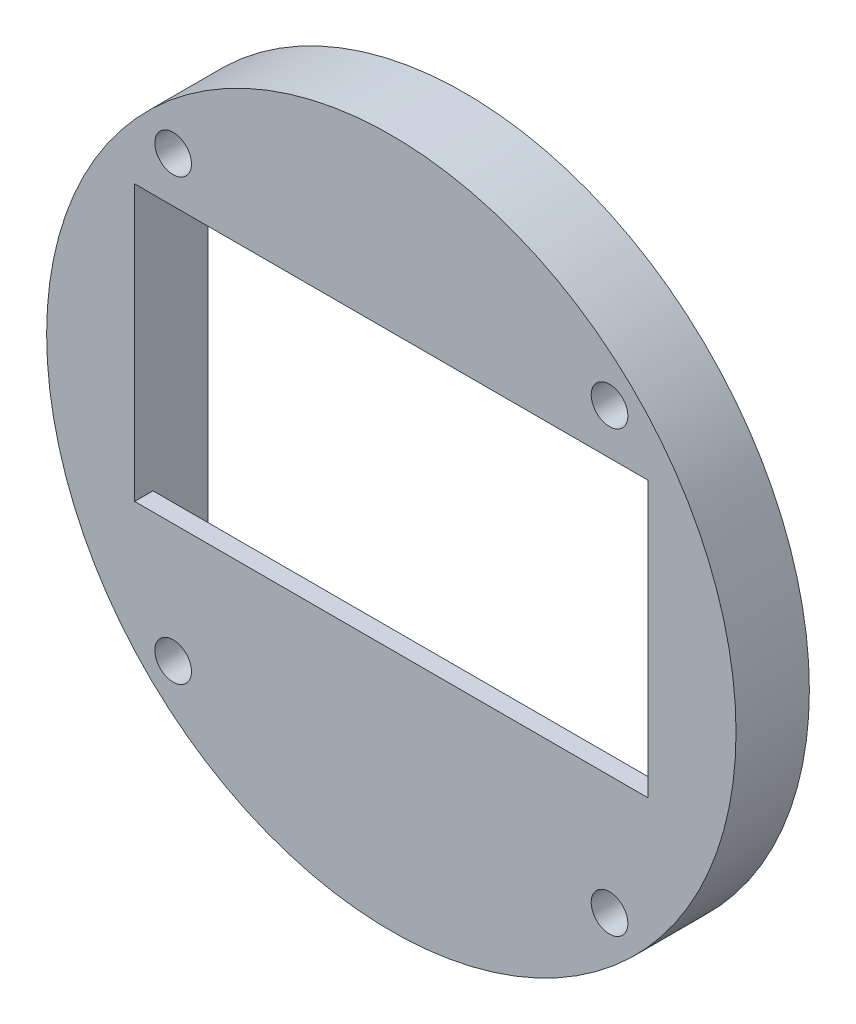
ISO-10303-21;
HEADER;
FILE_DESCRIPTION(('STEP AP214'),'2;1');
FILE_NAME('part.step','',(''),(''),'','','');
FILE_SCHEMA(('AUTOMOTIVE_DESIGN { 1 0 10303 214 1 1 1 1 }'));
ENDSEC;
DATA;
#1=APPLICATION_CONTEXT('core data for automotive mechanical design processes');
#2=APPLICATION_PROTOCOL_DEFINITION('international standard','automotive_design',2000,#1);
#3=PRODUCT_CONTEXT('',#1,'mechanical');
#4=PRODUCT('Part','Part','',(#3));
#5=PRODUCT_RELATED_PRODUCT_CATEGORY('part','',(#4));
#6=PRODUCT_DEFINITION_FORMATION('','',#4);
#7=PRODUCT_DEFINITION_CONTEXT('part definition',#1,'design');
#8=PRODUCT_DEFINITION('design','',#6,#7);
#9=PRODUCT_DEFINITION_SHAPE('','',#8);
#10=(LENGTH_UNIT() NAMED_UNIT(*) SI_UNIT(.MILLI.,.METRE.));
#11=(NAMED_UNIT(*) PLANE_ANGLE_UNIT() SI_UNIT($,.RADIAN.));
#12=(NAMED_UNIT(*) SI_UNIT($,.STERADIAN.) SOLID_ANGLE_UNIT());
#13=UNCERTAINTY_MEASURE_WITH_UNIT(LENGTH_MEASURE(1.E-05),#10,'distance_accuracy_value','');
#14=(GEOMETRIC_REPRESENTATION_CONTEXT(3) GLOBAL_UNCERTAINTY_ASSIGNED_CONTEXT((#13)) GLOBAL_UNIT_ASSIGNED_CONTEXT((#10,
#11,#12)) REPRESENTATION_CONTEXT('',''));
#15=CARTESIAN_POINT('',(0.,0.,0.));
#16=DIRECTION('',(0.,0.,1.));
#17=DIRECTION('',(1.,0.,0.));
#18=AXIS2_PLACEMENT_3D('',#15,#16,#17);
#19=CARTESIAN_POINT('',(-14.,-5.5,4.));
#20=DIRECTION('',(0.,1.,0.));
#21=DIRECTION('',(0.,0.,1.));
#22=AXIS2_PLACEMENT_3D('',#19,#20,#21);
#23=PLANE('',#22);
#24=DIRECTION('',(0.,0.,-1.));
#25=VECTOR('',#24,1.);
#26=CARTESIAN_POINT('',(14.,-5.5,4.));
#27=LINE('',#26,#25);
#28=CARTESIAN_POINT('',(14.,-5.5,4.));
#29=VERTEX_POINT('',#28);
#30=CARTESIAN_POINT('',(14.,-5.5,3.));
#31=VERTEX_POINT('',#30);
#32=EDGE_CURVE('E312',#29,#31,#27,.T.);
#33=ORIENTED_EDGE('',*,*,#32,.T.);
#34=DIRECTION('',(-1.,0.,0.));
#35=VECTOR('',#34,1.);
#36=CARTESIAN_POINT('',(-14.,-5.5,3.));
#37=LINE('',#36,#35);
#38=CARTESIAN_POINT('',(-14.,-5.5,3.));
#39=VERTEX_POINT('',#38);
#40=EDGE_CURVE('E179',#31,#39,#37,.T.);
#41=ORIENTED_EDGE('',*,*,#40,.T.);
#42=DIRECTION('',(0.,0.,-1.));
#43=VECTOR('',#42,1.);
#44=CARTESIAN_POINT('',(-14.,-5.5,4.));
#45=LINE('',#44,#43);
#46=CARTESIAN_POINT('',(-14.,-5.5,4.));
#47=VERTEX_POINT('',#46);
#48=EDGE_CURVE('E314',#47,#39,#45,.T.);
#49=ORIENTED_EDGE('',*,*,#48,.F.);
#50=DIRECTION('',(1.,0.,0.));
#51=VECTOR('',#50,1.);
#52=CARTESIAN_POINT('',(-14.,-5.5,4.));
#53=LINE('',#52,#51);
#54=EDGE_CURVE('E297',#47,#29,#53,.T.);
#55=ORIENTED_EDGE('',*,*,#54,.T.);
#56=EDGE_LOOP('',(#33,#41,#49,#55));
#57=FACE_BOUND('',#56,.T.);
#58=ADVANCED_FACE('F35',(#57),#23,.T.);
#59=CARTESIAN_POINT('',(14.,9.5,4.));
#60=DIRECTION('',(0.,-1.,0.));
#61=DIRECTION('',(1.,0.,0.));
#62=AXIS2_PLACEMENT_3D('',#59,#60,#61);
#63=PLANE('',#62);
#64=DIRECTION('',(0.,0.,-1.));
#65=VECTOR('',#64,1.);
#66=CARTESIAN_POINT('',(-14.,9.5,4.));
#67=LINE('',#66,#65);
#68=CARTESIAN_POINT('',(-14.,9.5,4.));
#69=VERTEX_POINT('',#68);
#70=CARTESIAN_POINT('',(-14.,9.5,3.));
#71=VERTEX_POINT('',#70);
#72=EDGE_CURVE('E304',#69,#71,#67,.T.);
#73=ORIENTED_EDGE('',*,*,#72,.T.);
#74=DIRECTION('',(1.,0.,0.));
#75=VECTOR('',#74,1.);
#76=CARTESIAN_POINT('',(14.,9.5,3.));
#77=LINE('',#76,#75);
#78=CARTESIAN_POINT('',(14.,9.5,3.));
#79=VERTEX_POINT('',#78);
#80=EDGE_CURVE('E321',#71,#79,#77,.T.);
#81=ORIENTED_EDGE('',*,*,#80,.T.);
#82=DIRECTION('',(0.,0.,-1.));
#83=VECTOR('',#82,1.);
#84=CARTESIAN_POINT('',(14.,9.5,4.));
#85=LINE('',#84,#83);
#86=CARTESIAN_POINT('',(14.,9.5,4.));
#87=VERTEX_POINT('',#86);
#88=EDGE_CURVE('E309',#87,#79,#85,.T.);
#89=ORIENTED_EDGE('',*,*,#88,.F.);
#90=DIRECTION('',(-1.,0.,0.));
#91=VECTOR('',#90,1.);
#92=CARTESIAN_POINT('',(14.,9.5,4.));
#93=LINE('',#92,#91);
#94=EDGE_CURVE('E302',#87,#69,#93,.T.);
#95=ORIENTED_EDGE('',*,*,#94,.T.);
#96=EDGE_LOOP('',(#73,#81,#89,#95));
#97=FACE_BOUND('',#96,.T.);
#98=ADVANCED_FACE('F384',(#97),#63,.T.);
#99=CARTESIAN_POINT('',(0.,0.,4.));
#100=DIRECTION('',(0.,0.,1.));
#101=DIRECTION('',(1.,0.,0.));
#102=AXIS2_PLACEMENT_3D('',#99,#100,#101);
#103=PLANE('',#102);
#104=CARTESIAN_POINT('',(11.9,-11.9856115107914,4.));
#105=DIRECTION('',(0.,0.,1.));
#106=DIRECTION('',(1.,0.,0.));
#107=AXIS2_PLACEMENT_3D('',#104,#105,#106);
#108=CIRCLE('',#107,1.);
#109=CARTESIAN_POINT('',(12.9,-11.9856115107914,4.));
#110=VERTEX_POINT('',#109);
#111=EDGE_CURVE('E277',#110,#110,#108,.T.);
#112=ORIENTED_EDGE('',*,*,#111,.F.);
#113=EDGE_LOOP('',(#112));
#114=FACE_BOUND('',#113,.T.);
#115=CARTESIAN_POINT('',(-11.9,11.9856115107914,4.));
#116=DIRECTION('',(0.,0.,1.));
#117=DIRECTION('',(1.,0.,0.));
#118=AXIS2_PLACEMENT_3D('',#115,#116,#117);
#119=CIRCLE('',#118,0.999999999999999);
#120=CARTESIAN_POINT('',(-10.9,11.9856115107914,4.));
#121=VERTEX_POINT('',#120);
#122=EDGE_CURVE('E289',#121,#121,#119,.T.);
#123=ORIENTED_EDGE('',*,*,#122,.F.);
#124=EDGE_LOOP('',(#123));
#125=FACE_BOUND('',#124,.T.);
#126=CARTESIAN_POINT('',(0.,0.,4.));
#127=DIRECTION('',(0.,0.,1.));
#128=DIRECTION('',(1.,0.,0.));
#129=AXIS2_PLACEMENT_3D('',#126,#127,#128);
#130=CIRCLE('',#129,18.8);
#131=CARTESIAN_POINT('',(18.8,0.,4.));
#132=VERTEX_POINT('',#131);
#133=EDGE_CURVE('E318',#132,#132,#130,.T.);
#134=ORIENTED_EDGE('',*,*,#133,.T.);
#135=EDGE_LOOP('',(#134));
#136=FACE_BOUND('',#135,.T.);
#137=ORIENTED_EDGE('',*,*,#54,.F.);
#138=DIRECTION('',(0.,-1.,0.));
#139=VECTOR('',#138,1.);
#140=CARTESIAN_POINT('',(-14.,-5.5,4.));
#141=LINE('',#140,#139);
#142=EDGE_CURVE('E295',#69,#47,#141,.T.);
#143=ORIENTED_EDGE('',*,*,#142,.F.);
#144=ORIENTED_EDGE('',*,*,#94,.F.);
#145=DIRECTION('',(0.,1.,0.));
#146=VECTOR('',#145,1.);
#147=CARTESIAN_POINT('',(14.,-5.5,4.));
#148=LINE('',#147,#146);
#149=EDGE_CURVE('E299',#29,#87,#148,.T.);
#150=ORIENTED_EDGE('',*,*,#149,.F.);
#151=EDGE_LOOP('',(#137,#143,#144,#150));
#152=FACE_BOUND('',#151,.T.);
#153=CARTESIAN_POINT('',(11.9,11.9856115107914,4.));
#154=DIRECTION('',(0.,0.,1.));
#155=DIRECTION('',(1.,0.,0.));
#156=AXIS2_PLACEMENT_3D('',#153,#154,#155);
#157=CIRCLE('',#156,0.999999999999999);
#158=CARTESIAN_POINT('',(12.9,11.9856115107914,4.));
#159=VERTEX_POINT('',#158);
#160=EDGE_CURVE('E283',#159,#159,#157,.T.);
#161=ORIENTED_EDGE('',*,*,#160,.F.);
#162=EDGE_LOOP('',(#161));
#163=FACE_BOUND('',#162,.T.);
#164=CARTESIAN_POINT('',(-11.9,-11.9856115107914,4.));
#165=DIRECTION('',(0.,0.,1.));
#166=DIRECTION('',(1.,0.,0.));
#167=AXIS2_PLACEMENT_3D('',#164,#165,#166);
#168=CIRCLE('',#167,1.);
#169=CARTESIAN_POINT('',(-10.9,-11.9856115107914,4.));
#170=VERTEX_POINT('',#169);
#171=EDGE_CURVE('E271',#170,#170,#168,.T.);
#172=ORIENTED_EDGE('',*,*,#171,.F.);
#173=EDGE_LOOP('',(#172));
#174=FACE_BOUND('',#173,.T.);
#175=ADVANCED_FACE('F391',(#114,#125,#136,#152,#163,#174),#103,.T.);
#176=CARTESIAN_POINT('',(0.,0.,0.));
#177=DIRECTION('',(0.,0.,1.));
#178=DIRECTION('',(1.,0.,0.));
#179=AXIS2_PLACEMENT_3D('',#176,#177,#178);
#180=PLANE('',#179);
#181=CARTESIAN_POINT('',(0.,0.,0.));
#182=DIRECTION('',(0.,0.,1.));
#183=DIRECTION('',(1.,0.,0.));
#184=AXIS2_PLACEMENT_3D('',#181,#182,#183);
#185=CIRCLE('',#184,18.8);
#186=CARTESIAN_POINT('',(18.8,0.,0.));
#187=VERTEX_POINT('',#186);
#188=EDGE_CURVE('E317',#187,#187,#185,.T.);
#189=ORIENTED_EDGE('',*,*,#188,.F.);
#190=EDGE_LOOP('',(#189));
#191=FACE_BOUND('',#190,.T.);
#192=DIRECTION('',(0.,1.,0.));
#193=VECTOR('',#192,1.);
#194=CARTESIAN_POINT('',(14.,-5.5,0.));
#195=LINE('',#194,#193);
#196=CARTESIAN_POINT('',(14.,-10.1,0.));
#197=VERTEX_POINT('',#196);
#198=CARTESIAN_POINT('',(14.,9.8,0.));
#199=VERTEX_POINT('',#198);
#200=EDGE_CURVE('E190',#197,#199,#195,.T.);
#201=ORIENTED_EDGE('',*,*,#200,.T.);
#202=DIRECTION('',(1.,0.,0.));
#203=VECTOR('',#202,1.);
#204=CARTESIAN_POINT('',(14.,9.8,0.));
#205=LINE('',#204,#203);
#206=CARTESIAN_POINT('',(7.,9.8,0.));
#207=VERTEX_POINT('',#206);
#208=EDGE_CURVE('E184',#207,#199,#205,.T.);
#209=ORIENTED_EDGE('',*,*,#208,.F.);
#210=DIRECTION('',(0.,-1.,0.));
#211=VECTOR('',#210,1.);
#212=CARTESIAN_POINT('',(7.,9.8,0.));
#213=LINE('',#212,#211);
#214=CARTESIAN_POINT('',(7.,12.8,0.));
#215=VERTEX_POINT('',#214);
#216=EDGE_CURVE('E248',#215,#207,#213,.T.);
#217=ORIENTED_EDGE('',*,*,#216,.F.);
#218=CARTESIAN_POINT('',(6.,12.8,0.));
#219=DIRECTION('',(0.,0.,1.));
#220=DIRECTION('',(1.,0.,0.));
#221=AXIS2_PLACEMENT_3D('',#218,#219,#220);
#222=CIRCLE('',#221,1.);
#223=CARTESIAN_POINT('',(6.,13.8,0.));
#224=VERTEX_POINT('',#223);
#225=EDGE_CURVE('E11',#215,#224,#222,.T.);
#226=ORIENTED_EDGE('',*,*,#225,.T.);
#227=DIRECTION('',(1.,0.,0.));
#228=VECTOR('',#227,1.);
#229=CARTESIAN_POINT('',(7.,13.8,0.));
#230=LINE('',#229,#228);
#231=CARTESIAN_POINT('',(-6.,13.8,0.));
#232=VERTEX_POINT('',#231);
#233=EDGE_CURVE('E245',#232,#224,#230,.T.);
#234=ORIENTED_EDGE('',*,*,#233,.F.);
#235=CARTESIAN_POINT('',(-6.,12.8,0.));
#236=DIRECTION('',(0.,0.,1.));
#237=DIRECTION('',(1.,0.,0.));
#238=AXIS2_PLACEMENT_3D('',#235,#236,#237);
#239=CIRCLE('',#238,1.);
#240=CARTESIAN_POINT('',(-7.,12.8,0.));
#241=VERTEX_POINT('',#240);
#242=EDGE_CURVE('E43',#232,#241,#239,.T.);
#243=ORIENTED_EDGE('',*,*,#242,.T.);
#244=DIRECTION('',(0.,1.,0.));
#245=VECTOR('',#244,1.);
#246=CARTESIAN_POINT('',(-7.,9.8,0.));
#247=LINE('',#246,#245);
#248=CARTESIAN_POINT('',(-7.,9.8,0.));
#249=VERTEX_POINT('',#248);
#250=EDGE_CURVE('E242',#249,#241,#247,.T.);
#251=ORIENTED_EDGE('',*,*,#250,.F.);
#252=DIRECTION('',(1.,0.,0.));
#253=VECTOR('',#252,1.);
#254=CARTESIAN_POINT('',(-7.,9.8,0.));
#255=LINE('',#254,#253);
#256=CARTESIAN_POINT('',(-14.,9.8,0.));
#257=VERTEX_POINT('',#256);
#258=EDGE_CURVE('E239',#257,#249,#255,.T.);
#259=ORIENTED_EDGE('',*,*,#258,.F.);
#260=DIRECTION('',(0.,-1.,0.));
#261=VECTOR('',#260,1.);
#262=CARTESIAN_POINT('',(-14.,-5.5,0.));
#263=LINE('',#262,#261);
#264=CARTESIAN_POINT('',(-14.,-10.1,0.));
#265=VERTEX_POINT('',#264);
#266=EDGE_CURVE('E292',#257,#265,#263,.T.);
#267=ORIENTED_EDGE('',*,*,#266,.T.);
#268=DIRECTION('',(-1.,0.,0.));
#269=VECTOR('',#268,1.);
#270=CARTESIAN_POINT('',(-7.,-10.1,0.));
#271=LINE('',#270,#269);
#272=CARTESIAN_POINT('',(-7.,-10.1,0.));
#273=VERTEX_POINT('',#272);
#274=EDGE_CURVE('E236',#273,#265,#271,.T.);
#275=ORIENTED_EDGE('',*,*,#274,.F.);
#276=DIRECTION('',(0.,1.,0.));
#277=VECTOR('',#276,1.);
#278=CARTESIAN_POINT('',(-7.,-10.1,0.));
#279=LINE('',#278,#277);
#280=CARTESIAN_POINT('',(-7.,-13.1,0.));
#281=VERTEX_POINT('',#280);
#282=EDGE_CURVE('E234',#281,#273,#279,.T.);
#283=ORIENTED_EDGE('',*,*,#282,.F.);
#284=CARTESIAN_POINT('',(-6.,-13.1,0.));
#285=DIRECTION('',(0.,0.,1.));
#286=DIRECTION('',(1.,0.,0.));
#287=AXIS2_PLACEMENT_3D('',#284,#285,#286);
#288=CIRCLE('',#287,1.);
#289=CARTESIAN_POINT('',(-6.,-14.1,0.));
#290=VERTEX_POINT('',#289);
#291=EDGE_CURVE('E354',#281,#290,#288,.T.);
#292=ORIENTED_EDGE('',*,*,#291,.T.);
#293=DIRECTION('',(-1.,0.,0.));
#294=VECTOR('',#293,1.);
#295=CARTESIAN_POINT('',(7.,-14.1,0.));
#296=LINE('',#295,#294);
#297=CARTESIAN_POINT('',(6.,-14.1,0.));
#298=VERTEX_POINT('',#297);
#299=EDGE_CURVE('E231',#298,#290,#296,.T.);
#300=ORIENTED_EDGE('',*,*,#299,.F.);
#301=CARTESIAN_POINT('',(6.,-13.1,0.));
#302=DIRECTION('',(0.,0.,1.));
#303=DIRECTION('',(1.,0.,0.));
#304=AXIS2_PLACEMENT_3D('',#301,#302,#303);
#305=CIRCLE('',#304,1.);
#306=CARTESIAN_POINT('',(7.,-13.1,0.));
#307=VERTEX_POINT('',#306);
#308=EDGE_CURVE('E352',#298,#307,#305,.T.);
#309=ORIENTED_EDGE('',*,*,#308,.T.);
#310=DIRECTION('',(0.,-1.,0.));
#311=VECTOR('',#310,1.);
#312=CARTESIAN_POINT('',(7.,-10.1,0.));
#313=LINE('',#312,#311);
#314=CARTESIAN_POINT('',(7.,-10.1,0.));
#315=VERTEX_POINT('',#314);
#316=EDGE_CURVE('E228',#315,#307,#313,.T.);
#317=ORIENTED_EDGE('',*,*,#316,.F.);
#318=DIRECTION('',(-1.,0.,0.));
#319=VECTOR('',#318,1.);
#320=CARTESIAN_POINT('',(14.,-10.1,0.));
#321=LINE('',#320,#319);
#322=EDGE_CURVE('E226',#197,#315,#321,.T.);
#323=ORIENTED_EDGE('',*,*,#322,.F.);
#324=EDGE_LOOP('',(#201,#209,#217,#226,#234,#243,#251,#259,#267,#275,#283,#292,#300,#309,#317,#323));
#325=FACE_BOUND('',#324,.T.);
#326=CARTESIAN_POINT('',(-11.9,11.9856115107914,0.));
#327=DIRECTION('',(0.,0.,1.));
#328=DIRECTION('',(1.,0.,0.));
#329=AXIS2_PLACEMENT_3D('',#326,#327,#328);
#330=CIRCLE('',#329,0.999999999999999);
#331=CARTESIAN_POINT('',(-10.9,11.9856115107914,0.));
#332=VERTEX_POINT('',#331);
#333=EDGE_CURVE('E286',#332,#332,#330,.T.);
#334=ORIENTED_EDGE('',*,*,#333,.T.);
#335=EDGE_LOOP('',(#334));
#336=FACE_BOUND('',#335,.T.);
#337=CARTESIAN_POINT('',(11.9,11.9856115107914,0.));
#338=DIRECTION('',(0.,0.,1.));
#339=DIRECTION('',(1.,0.,0.));
#340=AXIS2_PLACEMENT_3D('',#337,#338,#339);
#341=CIRCLE('',#340,0.999999999999999);
#342=CARTESIAN_POINT('',(12.9,11.9856115107914,0.));
#343=VERTEX_POINT('',#342);
#344=EDGE_CURVE('E280',#343,#343,#341,.T.);
#345=ORIENTED_EDGE('',*,*,#344,.T.);
#346=EDGE_LOOP('',(#345));
#347=FACE_BOUND('',#346,.T.);
#348=CARTESIAN_POINT('',(11.9,-11.9856115107914,0.));
#349=DIRECTION('',(0.,0.,1.));
#350=DIRECTION('',(1.,0.,0.));
#351=AXIS2_PLACEMENT_3D('',#348,#349,#350);
#352=CIRCLE('',#351,1.);
#353=CARTESIAN_POINT('',(12.9,-11.9856115107914,0.));
#354=VERTEX_POINT('',#353);
#355=EDGE_CURVE('E274',#354,#354,#352,.T.);
#356=ORIENTED_EDGE('',*,*,#355,.T.);
#357=EDGE_LOOP('',(#356));
#358=FACE_BOUND('',#357,.T.);
#359=CARTESIAN_POINT('',(-11.9,-11.9856115107914,0.));
#360=DIRECTION('',(0.,0.,1.));
#361=DIRECTION('',(1.,0.,0.));
#362=AXIS2_PLACEMENT_3D('',#359,#360,#361);
#363=CIRCLE('',#362,1.);
#364=CARTESIAN_POINT('',(-10.9,-11.9856115107914,0.));
#365=VERTEX_POINT('',#364);
#366=EDGE_CURVE('E270',#365,#365,#363,.T.);
#367=ORIENTED_EDGE('',*,*,#366,.T.);
#368=EDGE_LOOP('',(#367));
#369=FACE_BOUND('',#368,.T.);
#370=ADVANCED_FACE('F358',(#191,#325,#336,#347,#358,#369),#180,.F.);
#371=CARTESIAN_POINT('',(0.,0.,4.));
#372=DIRECTION('',(0.,0.,-1.));
#373=DIRECTION('',(-1.,0.,0.));
#374=AXIS2_PLACEMENT_3D('',#371,#372,#373);
#375=CYLINDRICAL_SURFACE('',#374,18.8);
#376=ORIENTED_EDGE('',*,*,#133,.F.);
#377=EDGE_LOOP('',(#376));
#378=FACE_BOUND('',#377,.T.);
#379=ORIENTED_EDGE('',*,*,#188,.T.);
#380=EDGE_LOOP('',(#379));
#381=FACE_BOUND('',#380,.T.);
#382=ADVANCED_FACE('F446',(#378,#381),#375,.T.);
#383=CARTESIAN_POINT('',(-14.,-5.5,4.));
#384=DIRECTION('',(1.,0.,0.));
#385=DIRECTION('',(0.,0.,-1.));
#386=AXIS2_PLACEMENT_3D('',#383,#384,#385);
#387=PLANE('',#386);
#388=DIRECTION('',(0.,1.,0.));
#389=VECTOR('',#388,1.);
#390=CARTESIAN_POINT('',(-14.,9.8,3.));
#391=LINE('',#390,#389);
#392=CARTESIAN_POINT('',(-14.,9.8,3.));
#393=VERTEX_POINT('',#392);
#394=EDGE_CURVE('E211',#71,#393,#391,.T.);
#395=ORIENTED_EDGE('',*,*,#394,.F.);
#396=ORIENTED_EDGE('',*,*,#72,.F.);
#397=ORIENTED_EDGE('',*,*,#142,.T.);
#398=ORIENTED_EDGE('',*,*,#48,.T.);
#399=CARTESIAN_POINT('',(-14.,-10.1,3.));
#400=VERTEX_POINT('',#399);
#401=EDGE_CURVE('E212',#400,#39,#391,.T.);
#402=ORIENTED_EDGE('',*,*,#401,.F.);
#403=DIRECTION('',(0.,0.,-1.));
#404=VECTOR('',#403,1.);
#405=CARTESIAN_POINT('',(-14.,-10.1,3.));
#406=LINE('',#405,#404);
#407=EDGE_CURVE('E262',#400,#265,#406,.T.);
#408=ORIENTED_EDGE('',*,*,#407,.T.);
#409=ORIENTED_EDGE('',*,*,#266,.F.);
#410=DIRECTION('',(0.,0.,-1.));
#411=VECTOR('',#410,1.);
#412=CARTESIAN_POINT('',(-14.,9.8,3.));
#413=LINE('',#412,#411);
#414=EDGE_CURVE('E259',#393,#257,#413,.T.);
#415=ORIENTED_EDGE('',*,*,#414,.F.);
#416=EDGE_LOOP('',(#395,#396,#397,#398,#402,#408,#409,#415));
#417=FACE_BOUND('',#416,.T.);
#418=ADVANCED_FACE('F394',(#417),#387,.T.);
#419=CARTESIAN_POINT('',(14.,-5.5,4.));
#420=DIRECTION('',(-1.,0.,0.));
#421=DIRECTION('',(0.,0.,1.));
#422=AXIS2_PLACEMENT_3D('',#419,#420,#421);
#423=PLANE('',#422);
#424=ORIENTED_EDGE('',*,*,#200,.F.);
#425=DIRECTION('',(0.,0.,-1.));
#426=VECTOR('',#425,1.);
#427=CARTESIAN_POINT('',(14.,-10.1,3.));
#428=LINE('',#427,#426);
#429=CARTESIAN_POINT('',(14.,-10.1,3.));
#430=VERTEX_POINT('',#429);
#431=EDGE_CURVE('E187',#430,#197,#428,.T.);
#432=ORIENTED_EDGE('',*,*,#431,.F.);
#433=DIRECTION('',(0.,-1.,0.));
#434=VECTOR('',#433,1.);
#435=CARTESIAN_POINT('',(14.,9.8,3.));
#436=LINE('',#435,#434);
#437=EDGE_CURVE('E172',#31,#430,#436,.T.);
#438=ORIENTED_EDGE('',*,*,#437,.F.);
#439=ORIENTED_EDGE('',*,*,#32,.F.);
#440=ORIENTED_EDGE('',*,*,#149,.T.);
#441=ORIENTED_EDGE('',*,*,#88,.T.);
#442=CARTESIAN_POINT('',(14.,9.8,3.));
#443=VERTEX_POINT('',#442);
#444=EDGE_CURVE('E183',#443,#79,#436,.T.);
#445=ORIENTED_EDGE('',*,*,#444,.F.);
#446=DIRECTION('',(0.,0.,-1.));
#447=VECTOR('',#446,1.);
#448=CARTESIAN_POINT('',(14.,9.8,3.));
#449=LINE('',#448,#447);
#450=EDGE_CURVE('E252',#443,#199,#449,.T.);
#451=ORIENTED_EDGE('',*,*,#450,.T.);
#452=EDGE_LOOP('',(#424,#432,#438,#439,#440,#441,#445,#451));
#453=FACE_BOUND('',#452,.T.);
#454=ADVANCED_FACE('F188',(#453),#423,.T.);
#455=CARTESIAN_POINT('',(-11.9,11.9856115107914,4.));
#456=DIRECTION('',(0.,0.,-1.));
#457=DIRECTION('',(-1.,0.,0.));
#458=AXIS2_PLACEMENT_3D('',#455,#456,#457);
#459=CYLINDRICAL_SURFACE('',#458,0.999999999999999);
#460=ORIENTED_EDGE('',*,*,#122,.T.);
#461=EDGE_LOOP('',(#460));
#462=FACE_BOUND('',#461,.T.);
#463=ORIENTED_EDGE('',*,*,#333,.F.);
#464=EDGE_LOOP('',(#463));
#465=FACE_BOUND('',#464,.T.);
#466=ADVANCED_FACE('F587',(#462,#465),#459,.F.);
#467=CARTESIAN_POINT('',(11.9,11.9856115107914,4.));
#468=DIRECTION('',(0.,0.,-1.));
#469=DIRECTION('',(-1.,0.,0.));
#470=AXIS2_PLACEMENT_3D('',#467,#468,#469);
#471=CYLINDRICAL_SURFACE('',#470,0.999999999999999);
#472=ORIENTED_EDGE('',*,*,#160,.T.);
#473=EDGE_LOOP('',(#472));
#474=FACE_BOUND('',#473,.T.);
#475=ORIENTED_EDGE('',*,*,#344,.F.);
#476=EDGE_LOOP('',(#475));
#477=FACE_BOUND('',#476,.T.);
#478=ADVANCED_FACE('F623',(#474,#477),#471,.F.);
#479=CARTESIAN_POINT('',(11.9,-11.9856115107914,4.));
#480=DIRECTION('',(0.,0.,-1.));
#481=DIRECTION('',(-1.,0.,0.));
#482=AXIS2_PLACEMENT_3D('',#479,#480,#481);
#483=CYLINDRICAL_SURFACE('',#482,1.);
#484=ORIENTED_EDGE('',*,*,#111,.T.);
#485=EDGE_LOOP('',(#484));
#486=FACE_BOUND('',#485,.T.);
#487=ORIENTED_EDGE('',*,*,#355,.F.);
#488=EDGE_LOOP('',(#487));
#489=FACE_BOUND('',#488,.T.);
#490=ADVANCED_FACE('F613',(#486,#489),#483,.F.);
#491=CARTESIAN_POINT('',(-11.9,-11.9856115107914,4.));
#492=DIRECTION('',(0.,0.,-1.));
#493=DIRECTION('',(-1.,0.,0.));
#494=AXIS2_PLACEMENT_3D('',#491,#492,#493);
#495=CYLINDRICAL_SURFACE('',#494,1.);
#496=ORIENTED_EDGE('',*,*,#171,.T.);
#497=EDGE_LOOP('',(#496));
#498=FACE_BOUND('',#497,.T.);
#499=ORIENTED_EDGE('',*,*,#366,.F.);
#500=EDGE_LOOP('',(#499));
#501=FACE_BOUND('',#500,.T.);
#502=ADVANCED_FACE('F547',(#498,#501),#495,.F.);
#503=CARTESIAN_POINT('',(0.,0.,3.));
#504=DIRECTION('',(0.,0.,-1.));
#505=DIRECTION('',(-1.,0.,0.));
#506=AXIS2_PLACEMENT_3D('',#503,#504,#505);
#507=PLANE('',#506);
#508=DIRECTION('',(0.,1.,0.));
#509=VECTOR('',#508,1.);
#510=CARTESIAN_POINT('',(-7.,9.8,3.));
#511=LINE('',#510,#509);
#512=CARTESIAN_POINT('',(-7.,9.8,3.));
#513=VERTEX_POINT('',#512);
#514=CARTESIAN_POINT('',(-7.,12.8,3.));
#515=VERTEX_POINT('',#514);
#516=EDGE_CURVE('E217',#513,#515,#511,.T.);
#517=ORIENTED_EDGE('',*,*,#516,.T.);
#518=CARTESIAN_POINT('',(-6.,12.8,3.));
#519=DIRECTION('',(0.,0.,-1.));
#520=DIRECTION('',(-1.,0.,0.));
#521=AXIS2_PLACEMENT_3D('',#518,#519,#520);
#522=CIRCLE('',#521,1.);
#523=CARTESIAN_POINT('',(-6.,13.8,3.));
#524=VERTEX_POINT('',#523);
#525=EDGE_CURVE('E348',#515,#524,#522,.T.);
#526=ORIENTED_EDGE('',*,*,#525,.T.);
#527=DIRECTION('',(1.,0.,0.));
#528=VECTOR('',#527,1.);
#529=CARTESIAN_POINT('',(7.,13.8,3.));
#530=LINE('',#529,#528);
#531=CARTESIAN_POINT('',(6.,13.8,3.));
#532=VERTEX_POINT('',#531);
#533=EDGE_CURVE('E220',#524,#532,#530,.T.);
#534=ORIENTED_EDGE('',*,*,#533,.T.);
#535=CARTESIAN_POINT('',(6.,12.8,3.));
#536=DIRECTION('',(0.,0.,-1.));
#537=DIRECTION('',(-1.,0.,0.));
#538=AXIS2_PLACEMENT_3D('',#535,#536,#537);
#539=CIRCLE('',#538,1.);
#540=CARTESIAN_POINT('',(7.,12.8,3.));
#541=VERTEX_POINT('',#540);
#542=EDGE_CURVE('E56',#532,#541,#539,.T.);
#543=ORIENTED_EDGE('',*,*,#542,.T.);
#544=DIRECTION('',(0.,-1.,0.));
#545=VECTOR('',#544,1.);
#546=CARTESIAN_POINT('',(7.,9.8,3.));
#547=LINE('',#546,#545);
#548=CARTESIAN_POINT('',(7.,9.8,3.));
#549=VERTEX_POINT('',#548);
#550=EDGE_CURVE('E222',#541,#549,#547,.T.);
#551=ORIENTED_EDGE('',*,*,#550,.T.);
#552=DIRECTION('',(1.,0.,0.));
#553=VECTOR('',#552,1.);
#554=CARTESIAN_POINT('',(14.,9.8,3.));
#555=LINE('',#554,#553);
#556=EDGE_CURVE('E195',#549,#443,#555,.T.);
#557=ORIENTED_EDGE('',*,*,#556,.T.);
#558=ORIENTED_EDGE('',*,*,#444,.T.);
#559=ORIENTED_EDGE('',*,*,#80,.F.);
#560=ORIENTED_EDGE('',*,*,#394,.T.);
#561=DIRECTION('',(1.,0.,0.));
#562=VECTOR('',#561,1.);
#563=CARTESIAN_POINT('',(-7.,9.8,3.));
#564=LINE('',#563,#562);
#565=EDGE_CURVE('E214',#393,#513,#564,.T.);
#566=ORIENTED_EDGE('',*,*,#565,.T.);
#567=EDGE_LOOP('',(#517,#526,#534,#543,#551,#557,#558,#559,#560,#566));
#568=FACE_BOUND('',#567,.T.);
#569=ADVANCED_FACE('F370',(#568),#507,.T.);
#570=CARTESIAN_POINT('',(-7.,9.8,3.));
#571=DIRECTION('',(0.,1.,0.));
#572=DIRECTION('',(0.,0.,1.));
#573=AXIS2_PLACEMENT_3D('',#570,#571,#572);
#574=PLANE('',#573);
#575=ORIENTED_EDGE('',*,*,#258,.T.);
#576=DIRECTION('',(0.,0.,-1.));
#577=VECTOR('',#576,1.);
#578=CARTESIAN_POINT('',(-7.,9.8,3.));
#579=LINE('',#578,#577);
#580=EDGE_CURVE('E257',#513,#249,#579,.T.);
#581=ORIENTED_EDGE('',*,*,#580,.F.);
#582=ORIENTED_EDGE('',*,*,#565,.F.);
#583=ORIENTED_EDGE('',*,*,#414,.T.);
#584=EDGE_LOOP('',(#575,#581,#582,#583));
#585=FACE_BOUND('',#584,.T.);
#586=ADVANCED_FACE('F399',(#585),#574,.F.);
#587=CARTESIAN_POINT('',(-7.,9.8,3.));
#588=DIRECTION('',(-1.,0.,0.));
#589=DIRECTION('',(0.,-1.,0.));
#590=AXIS2_PLACEMENT_3D('',#587,#588,#589);
#591=PLANE('',#590);
#592=ORIENTED_EDGE('',*,*,#250,.T.);
#593=DIRECTION('',(0.,0.,-1.));
#594=VECTOR('',#593,1.);
#595=CARTESIAN_POINT('',(-7.,12.8,3.));
#596=LINE('',#595,#594);
#597=EDGE_CURVE('E345',#241,#515,#596,.F.);
#598=ORIENTED_EDGE('',*,*,#597,.T.);
#599=ORIENTED_EDGE('',*,*,#516,.F.);
#600=ORIENTED_EDGE('',*,*,#580,.T.);
#601=EDGE_LOOP('',(#592,#598,#599,#600));
#602=FACE_BOUND('',#601,.T.);
#603=ADVANCED_FACE('F365',(#602),#591,.F.);
#604=CARTESIAN_POINT('',(7.,13.8,3.));
#605=DIRECTION('',(0.,1.,0.));
#606=DIRECTION('',(0.,0.,1.));
#607=AXIS2_PLACEMENT_3D('',#604,#605,#606);
#608=PLANE('',#607);
#609=ORIENTED_EDGE('',*,*,#533,.F.);
#610=DIRECTION('',(0.,0.,-1.));
#611=VECTOR('',#610,1.);
#612=CARTESIAN_POINT('',(-6.,13.8,0.));
#613=LINE('',#612,#611);
#614=EDGE_CURVE('E342',#524,#232,#613,.T.);
#615=ORIENTED_EDGE('',*,*,#614,.T.);
#616=ORIENTED_EDGE('',*,*,#233,.T.);
#617=DIRECTION('',(0.,0.,-1.));
#618=VECTOR('',#617,1.);
#619=CARTESIAN_POINT('',(6.,13.8,3.));
#620=LINE('',#619,#618);
#621=EDGE_CURVE('E340',#224,#532,#620,.F.);
#622=ORIENTED_EDGE('',*,*,#621,.T.);
#623=EDGE_LOOP('',(#609,#615,#616,#622));
#624=FACE_BOUND('',#623,.T.);
#625=ADVANCED_FACE('F372',(#624),#608,.F.);
#626=CARTESIAN_POINT('',(7.,9.8,3.));
#627=DIRECTION('',(1.,0.,0.));
#628=DIRECTION('',(0.,0.,-1.));
#629=AXIS2_PLACEMENT_3D('',#626,#627,#628);
#630=PLANE('',#629);
#631=ORIENTED_EDGE('',*,*,#550,.F.);
#632=DIRECTION('',(0.,0.,-1.));
#633=VECTOR('',#632,1.);
#634=CARTESIAN_POINT('',(7.,12.8,0.));
#635=LINE('',#634,#633);
#636=EDGE_CURVE('E350',#541,#215,#635,.T.);
#637=ORIENTED_EDGE('',*,*,#636,.T.);
#638=ORIENTED_EDGE('',*,*,#216,.T.);
#639=DIRECTION('',(0.,0.,-1.));
#640=VECTOR('',#639,1.);
#641=CARTESIAN_POINT('',(7.,9.8,3.));
#642=LINE('',#641,#640);
#643=EDGE_CURVE('E254',#549,#207,#642,.T.);
#644=ORIENTED_EDGE('',*,*,#643,.F.);
#645=EDGE_LOOP('',(#631,#637,#638,#644));
#646=FACE_BOUND('',#645,.T.);
#647=ADVANCED_FACE('F375',(#646),#630,.F.);
#648=CARTESIAN_POINT('',(14.,9.8,3.));
#649=DIRECTION('',(0.,1.,0.));
#650=DIRECTION('',(0.,0.,1.));
#651=AXIS2_PLACEMENT_3D('',#648,#649,#650);
#652=PLANE('',#651);
#653=ORIENTED_EDGE('',*,*,#208,.T.);
#654=ORIENTED_EDGE('',*,*,#450,.F.);
#655=ORIENTED_EDGE('',*,*,#556,.F.);
#656=ORIENTED_EDGE('',*,*,#643,.T.);
#657=EDGE_LOOP('',(#653,#654,#655,#656));
#658=FACE_BOUND('',#657,.T.);
#659=ADVANCED_FACE('F379',(#658),#652,.F.);
#660=DIRECTION('',(0.,-1.,0.));
#661=VECTOR('',#660,1.);
#662=CARTESIAN_POINT('',(7.,-10.1,3.));
#663=LINE('',#662,#661);
#664=CARTESIAN_POINT('',(7.,-10.1,3.));
#665=VERTEX_POINT('',#664);
#666=CARTESIAN_POINT('',(7.,-13.1,3.));
#667=VERTEX_POINT('',#666);
#668=EDGE_CURVE('E199',#665,#667,#663,.T.);
#669=ORIENTED_EDGE('',*,*,#668,.T.);
#670=CARTESIAN_POINT('',(6.,-13.1,3.));
#671=DIRECTION('',(0.,0.,-1.));
#672=DIRECTION('',(-1.,0.,0.));
#673=AXIS2_PLACEMENT_3D('',#670,#671,#672);
#674=CIRCLE('',#673,1.);
#675=CARTESIAN_POINT('',(6.,-14.1,3.));
#676=VERTEX_POINT('',#675);
#677=EDGE_CURVE('E335',#667,#676,#674,.T.);
#678=ORIENTED_EDGE('',*,*,#677,.T.);
#679=DIRECTION('',(-1.,0.,0.));
#680=VECTOR('',#679,1.);
#681=CARTESIAN_POINT('',(7.,-14.1,3.));
#682=LINE('',#681,#680);
#683=CARTESIAN_POINT('',(-6.,-14.1,3.));
#684=VERTEX_POINT('',#683);
#685=EDGE_CURVE('E201',#676,#684,#682,.T.);
#686=ORIENTED_EDGE('',*,*,#685,.T.);
#687=CARTESIAN_POINT('',(-6.,-13.1,3.));
#688=DIRECTION('',(0.,0.,-1.));
#689=DIRECTION('',(-1.,0.,0.));
#690=AXIS2_PLACEMENT_3D('',#687,#688,#689);
#691=CIRCLE('',#690,1.);
#692=CARTESIAN_POINT('',(-7.,-13.1,3.));
#693=VERTEX_POINT('',#692);
#694=EDGE_CURVE('E333',#684,#693,#691,.T.);
#695=ORIENTED_EDGE('',*,*,#694,.T.);
#696=DIRECTION('',(0.,1.,0.));
#697=VECTOR('',#696,1.);
#698=CARTESIAN_POINT('',(-7.,-10.1,3.));
#699=LINE('',#698,#697);
#700=CARTESIAN_POINT('',(-7.,-10.1,3.));
#701=VERTEX_POINT('',#700);
#702=EDGE_CURVE('E206',#693,#701,#699,.T.);
#703=ORIENTED_EDGE('',*,*,#702,.T.);
#704=DIRECTION('',(-1.,0.,0.));
#705=VECTOR('',#704,1.);
#706=CARTESIAN_POINT('',(-7.,-10.1,3.));
#707=LINE('',#706,#705);
#708=EDGE_CURVE('E208',#701,#400,#707,.T.);
#709=ORIENTED_EDGE('',*,*,#708,.T.);
#710=ORIENTED_EDGE('',*,*,#401,.T.);
#711=ORIENTED_EDGE('',*,*,#40,.F.);
#712=ORIENTED_EDGE('',*,*,#437,.T.);
#713=DIRECTION('',(-1.,0.,0.));
#714=VECTOR('',#713,1.);
#715=CARTESIAN_POINT('',(14.,-10.1,3.));
#716=LINE('',#715,#714);
#717=EDGE_CURVE('E177',#430,#665,#716,.T.);
#718=ORIENTED_EDGE('',*,*,#717,.T.);
#719=EDGE_LOOP('',(#669,#678,#686,#695,#703,#709,#710,#711,#712,#718));
#720=FACE_BOUND('',#719,.T.);
#721=ADVANCED_FACE('F175',(#720),#507,.T.);
#722=CARTESIAN_POINT('',(-7.,-10.1,3.));
#723=DIRECTION('',(0.,-1.,0.));
#724=DIRECTION('',(0.,0.,-1.));
#725=AXIS2_PLACEMENT_3D('',#722,#723,#724);
#726=PLANE('',#725);
#727=ORIENTED_EDGE('',*,*,#274,.T.);
#728=ORIENTED_EDGE('',*,*,#407,.F.);
#729=ORIENTED_EDGE('',*,*,#708,.F.);
#730=DIRECTION('',(0.,0.,-1.));
#731=VECTOR('',#730,1.);
#732=CARTESIAN_POINT('',(-7.,-10.1,3.));
#733=LINE('',#732,#731);
#734=EDGE_CURVE('E265',#701,#273,#733,.T.);
#735=ORIENTED_EDGE('',*,*,#734,.T.);
#736=EDGE_LOOP('',(#727,#728,#729,#735));
#737=FACE_BOUND('',#736,.T.);
#738=ADVANCED_FACE('F405',(#737),#726,.F.);
#739=CARTESIAN_POINT('',(-7.,-10.1,3.));
#740=DIRECTION('',(-1.,0.,0.));
#741=DIRECTION('',(0.,-1.,0.));
#742=AXIS2_PLACEMENT_3D('',#739,#740,#741);
#743=PLANE('',#742);
#744=ORIENTED_EDGE('',*,*,#702,.F.);
#745=DIRECTION('',(0.,0.,-1.));
#746=VECTOR('',#745,1.);
#747=CARTESIAN_POINT('',(-7.,-13.1,0.));
#748=LINE('',#747,#746);
#749=EDGE_CURVE('E337',#693,#281,#748,.T.);
#750=ORIENTED_EDGE('',*,*,#749,.T.);
#751=ORIENTED_EDGE('',*,*,#282,.T.);
#752=ORIENTED_EDGE('',*,*,#734,.F.);
#753=EDGE_LOOP('',(#744,#750,#751,#752));
#754=FACE_BOUND('',#753,.T.);
#755=ADVANCED_FACE('F409',(#754),#743,.F.);
#756=CARTESIAN_POINT('',(7.,-14.1,3.));
#757=DIRECTION('',(0.,-1.,0.));
#758=DIRECTION('',(0.,0.,-1.));
#759=AXIS2_PLACEMENT_3D('',#756,#757,#758);
#760=PLANE('',#759);
#761=ORIENTED_EDGE('',*,*,#685,.F.);
#762=DIRECTION('',(0.,0.,-1.));
#763=VECTOR('',#762,1.);
#764=CARTESIAN_POINT('',(6.,-14.1,0.));
#765=LINE('',#764,#763);
#766=EDGE_CURVE('E328',#676,#298,#765,.T.);
#767=ORIENTED_EDGE('',*,*,#766,.T.);
#768=ORIENTED_EDGE('',*,*,#299,.T.);
#769=DIRECTION('',(0.,0.,-1.));
#770=VECTOR('',#769,1.);
#771=CARTESIAN_POINT('',(-6.,-14.1,3.));
#772=LINE('',#771,#770);
#773=EDGE_CURVE('E326',#290,#684,#772,.F.);
#774=ORIENTED_EDGE('',*,*,#773,.T.);
#775=EDGE_LOOP('',(#761,#767,#768,#774));
#776=FACE_BOUND('',#775,.T.);
#777=ADVANCED_FACE('F416',(#776),#760,.F.);
#778=CARTESIAN_POINT('',(7.,-10.1,3.));
#779=DIRECTION('',(1.,0.,0.));
#780=DIRECTION('',(0.,1.,0.));
#781=AXIS2_PLACEMENT_3D('',#778,#779,#780);
#782=PLANE('',#781);
#783=ORIENTED_EDGE('',*,*,#316,.T.);
#784=DIRECTION('',(0.,0.,-1.));
#785=VECTOR('',#784,1.);
#786=CARTESIAN_POINT('',(7.,-13.1,3.));
#787=LINE('',#786,#785);
#788=EDGE_CURVE('E331',#307,#667,#787,.F.);
#789=ORIENTED_EDGE('',*,*,#788,.T.);
#790=ORIENTED_EDGE('',*,*,#668,.F.);
#791=DIRECTION('',(0.,0.,-1.));
#792=VECTOR('',#791,1.);
#793=CARTESIAN_POINT('',(7.,-10.1,3.));
#794=LINE('',#793,#792);
#795=EDGE_CURVE('E194',#665,#315,#794,.T.);
#796=ORIENTED_EDGE('',*,*,#795,.T.);
#797=EDGE_LOOP('',(#783,#789,#790,#796));
#798=FACE_BOUND('',#797,.T.);
#799=ADVANCED_FACE('F426',(#798),#782,.F.);
#800=CARTESIAN_POINT('',(14.,-10.1,3.));
#801=DIRECTION('',(0.,-1.,0.));
#802=DIRECTION('',(0.,0.,-1.));
#803=AXIS2_PLACEMENT_3D('',#800,#801,#802);
#804=PLANE('',#803);
#805=ORIENTED_EDGE('',*,*,#322,.T.);
#806=ORIENTED_EDGE('',*,*,#795,.F.);
#807=ORIENTED_EDGE('',*,*,#717,.F.);
#808=ORIENTED_EDGE('',*,*,#431,.T.);
#809=EDGE_LOOP('',(#805,#806,#807,#808));
#810=FACE_BOUND('',#809,.T.);
#811=ADVANCED_FACE('F197',(#810),#804,.F.);
#812=CARTESIAN_POINT('',(6.,-13.1,3.));
#813=DIRECTION('',(0.,0.,1.));
#814=DIRECTION('',(1.,0.,0.));
#815=AXIS2_PLACEMENT_3D('',#812,#813,#814);
#816=CYLINDRICAL_SURFACE('',#815,1.);
#817=ORIENTED_EDGE('',*,*,#677,.F.);
#818=ORIENTED_EDGE('',*,*,#788,.F.);
#819=ORIENTED_EDGE('',*,*,#308,.F.);
#820=ORIENTED_EDGE('',*,*,#766,.F.);
#821=EDGE_LOOP('',(#817,#818,#819,#820));
#822=FACE_BOUND('',#821,.T.);
#823=ADVANCED_FACE('F422',(#822),#816,.F.);
#824=CARTESIAN_POINT('',(-6.,-13.1,3.));
#825=DIRECTION('',(0.,0.,1.));
#826=DIRECTION('',(1.,0.,0.));
#827=AXIS2_PLACEMENT_3D('',#824,#825,#826);
#828=CYLINDRICAL_SURFACE('',#827,1.);
#829=ORIENTED_EDGE('',*,*,#694,.F.);
#830=ORIENTED_EDGE('',*,*,#773,.F.);
#831=ORIENTED_EDGE('',*,*,#291,.F.);
#832=ORIENTED_EDGE('',*,*,#749,.F.);
#833=EDGE_LOOP('',(#829,#830,#831,#832));
#834=FACE_BOUND('',#833,.T.);
#835=ADVANCED_FACE('F419',(#834),#828,.F.);
#836=CARTESIAN_POINT('',(-6.,12.8,3.));
#837=DIRECTION('',(0.,0.,1.));
#838=DIRECTION('',(1.,0.,0.));
#839=AXIS2_PLACEMENT_3D('',#836,#837,#838);
#840=CYLINDRICAL_SURFACE('',#839,1.);
#841=ORIENTED_EDGE('',*,*,#525,.F.);
#842=ORIENTED_EDGE('',*,*,#597,.F.);
#843=ORIENTED_EDGE('',*,*,#242,.F.);
#844=ORIENTED_EDGE('',*,*,#614,.F.);
#845=EDGE_LOOP('',(#841,#842,#843,#844));
#846=FACE_BOUND('',#845,.T.);
#847=ADVANCED_FACE('F368',(#846),#840,.F.);
#848=CARTESIAN_POINT('',(6.,12.8,3.));
#849=DIRECTION('',(0.,0.,1.));
#850=DIRECTION('',(1.,0.,0.));
#851=AXIS2_PLACEMENT_3D('',#848,#849,#850);
#852=CYLINDRICAL_SURFACE('',#851,1.);
#853=ORIENTED_EDGE('',*,*,#542,.F.);
#854=ORIENTED_EDGE('',*,*,#621,.F.);
#855=ORIENTED_EDGE('',*,*,#225,.F.);
#856=ORIENTED_EDGE('',*,*,#636,.F.);
#857=EDGE_LOOP('',(#853,#854,#855,#856));
#858=FACE_BOUND('',#857,.T.);
#859=ADVANCED_FACE('F37',(#858),#852,.F.);
#860=CLOSED_SHELL('',(#58,#98,#175,#370,#382,#418,#454,#466,#478,#490,#502,#569,#586,#603,#625,
#647,#659,#721,#738,#755,#777,#799,#811,#823,#835,#847,#859));
#861=MANIFOLD_SOLID_BREP('B2',#860);
#862=ADVANCED_BREP_SHAPE_REPRESENTATION('',(#18,#861),#14);
#863=SHAPE_DEFINITION_REPRESENTATION(#9,#862);
ENDSEC;
END-ISO-10303-21;
